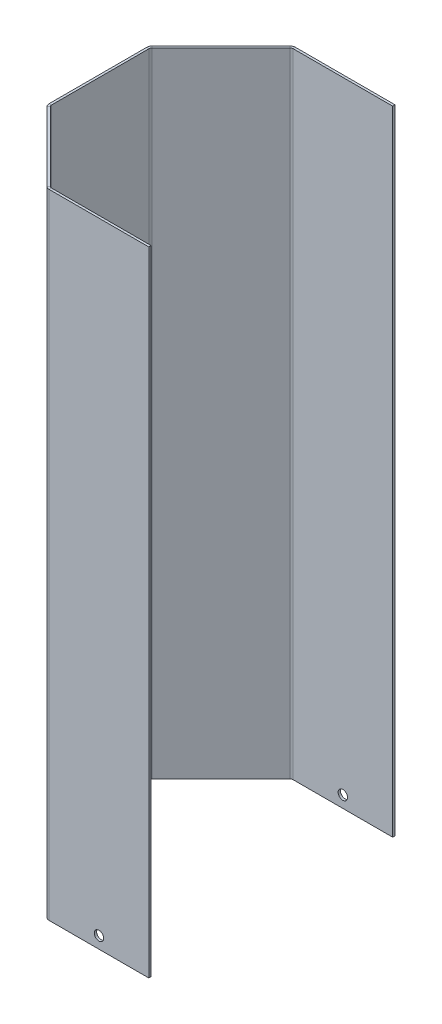
ISO-10303-21;
HEADER;
FILE_DESCRIPTION(('STEP AP214'),'2;1');
FILE_NAME('part.step','',(''),(''),'','','');
FILE_SCHEMA(('AUTOMOTIVE_DESIGN { 1 0 10303 214 1 1 1 1 }'));
ENDSEC;
DATA;
#1=APPLICATION_CONTEXT('core data for automotive mechanical design processes');
#2=APPLICATION_PROTOCOL_DEFINITION('international standard','automotive_design',2000,#1);
#3=PRODUCT_CONTEXT('',#1,'mechanical');
#4=PRODUCT('Part','Part','',(#3));
#5=PRODUCT_RELATED_PRODUCT_CATEGORY('part','',(#4));
#6=PRODUCT_DEFINITION_FORMATION('','',#4);
#7=PRODUCT_DEFINITION_CONTEXT('part definition',#1,'design');
#8=PRODUCT_DEFINITION('design','',#6,#7);
#9=PRODUCT_DEFINITION_SHAPE('','',#8);
#10=(LENGTH_UNIT() NAMED_UNIT(*) SI_UNIT(.MILLI.,.METRE.));
#11=(NAMED_UNIT(*) PLANE_ANGLE_UNIT() SI_UNIT($,.RADIAN.));
#12=(NAMED_UNIT(*) SI_UNIT($,.STERADIAN.) SOLID_ANGLE_UNIT());
#13=UNCERTAINTY_MEASURE_WITH_UNIT(LENGTH_MEASURE(1.E-05),#10,'distance_accuracy_value','');
#14=(GEOMETRIC_REPRESENTATION_CONTEXT(3) GLOBAL_UNCERTAINTY_ASSIGNED_CONTEXT((#13)) GLOBAL_UNIT_ASSIGNED_CONTEXT((#10,
#11,#12)) REPRESENTATION_CONTEXT('',''));
#15=CARTESIAN_POINT('',(0.,0.,0.));
#16=DIRECTION('',(0.,0.,1.));
#17=DIRECTION('',(1.,0.,0.));
#18=AXIS2_PLACEMENT_3D('',#15,#16,#17);
#19=CARTESIAN_POINT('',(-220.704754347643,270.,-51.1485281374239));
#20=DIRECTION('',(0.,1.,0.));
#21=DIRECTION('',(0.,0.,1.));
#22=AXIS2_PLACEMENT_3D('',#19,#20,#21);
#23=PLANE('',#22);
#24=DIRECTION('',(-0.707106781186547,0.,-0.707106781186547));
#25=VECTOR('',#24,1.);
#26=CARTESIAN_POINT('',(-220.704754347643,270.,-51.1485281374239));
#27=LINE('',#26,#25);
#28=CARTESIAN_POINT('',(-220.704754347643,270.,-51.1485281374239));
#29=VERTEX_POINT('',#28);
#30=CARTESIAN_POINT('',(-221.411861128829,270.,-51.8556349186104));
#31=VERTEX_POINT('',#30);
#32=EDGE_CURVE('E11',#29,#31,#27,.T.);
#33=ORIENTED_EDGE('',*,*,#32,.F.);
#34=CARTESIAN_POINT('',(-219.856226210219,270.,-50.3));
#35=DIRECTION('',(0.,-1.,0.));
#36=DIRECTION('',(0.,0.,-1.));
#37=AXIS2_PLACEMENT_3D('',#34,#35,#36);
#38=CIRCLE('',#37,1.2);
#39=CARTESIAN_POINT('',(-219.856226210219,270.,-51.5));
#40=VERTEX_POINT('',#39);
#41=EDGE_CURVE('E366',#40,#29,#38,.F.);
#42=ORIENTED_EDGE('',*,*,#41,.F.);
#43=DIRECTION('',(0.,0.,1.));
#44=VECTOR('',#43,1.);
#45=CARTESIAN_POINT('',(-219.856226210219,270.,-52.5));
#46=LINE('',#45,#44);
#47=CARTESIAN_POINT('',(-219.856226210219,270.,-52.5));
#48=VERTEX_POINT('',#47);
#49=EDGE_CURVE('E43',#48,#40,#46,.T.);
#50=ORIENTED_EDGE('',*,*,#49,.F.);
#51=CARTESIAN_POINT('',(-219.856226210219,270.,-50.3));
#52=DIRECTION('',(0.,1.,0.));
#53=DIRECTION('',(1.,0.,0.));
#54=AXIS2_PLACEMENT_3D('',#51,#52,#53);
#55=CIRCLE('',#54,2.2);
#56=EDGE_CURVE('E379',#48,#31,#55,.T.);
#57=ORIENTED_EDGE('',*,*,#56,.T.);
#58=EDGE_LOOP('',(#33,#42,#50,#57));
#59=FACE_BOUND('',#58,.T.);
#60=ADVANCED_FACE('F34',(#59),#23,.T.);
#61=CARTESIAN_POINT('',(-219.856226210219,270.,-52.5));
#62=DIRECTION('',(0.,1.,0.));
#63=DIRECTION('',(0.,0.,1.));
#64=AXIS2_PLACEMENT_3D('',#61,#62,#63);
#65=PLANE('',#64);
#66=DIRECTION('',(-0.707106781186548,0.,0.707106781186547));
#67=VECTOR('',#66,1.);
#68=CARTESIAN_POINT('',(-220.353282485067,270.,-51.5));
#69=LINE('',#68,#67);
#70=CARTESIAN_POINT('',(-250.169812160276,270.,-21.6834703247905));
#71=VERTEX_POINT('',#70);
#72=EDGE_CURVE('E370',#29,#71,#69,.T.);
#73=ORIENTED_EDGE('',*,*,#72,.F.);
#74=ORIENTED_EDGE('',*,*,#32,.T.);
#75=DIRECTION('',(-0.707106781186548,0.,0.707106781186547));
#76=VECTOR('',#75,1.);
#77=CARTESIAN_POINT('',(-221.060389266253,270.,-52.2071067811866));
#78=LINE('',#77,#76);
#79=CARTESIAN_POINT('',(-250.876918941463,270.,-22.3905771059771));
#80=VERTEX_POINT('',#79);
#81=EDGE_CURVE('E381',#31,#80,#78,.T.);
#82=ORIENTED_EDGE('',*,*,#81,.T.);
#83=DIRECTION('',(0.707106781186523,0.,0.707106781186572));
#84=VECTOR('',#83,1.);
#85=CARTESIAN_POINT('',(-250.876918941463,270.,-22.3905771059771));
#86=LINE('',#85,#84);
#87=EDGE_CURVE('E339',#80,#71,#86,.T.);
#88=ORIENTED_EDGE('',*,*,#87,.T.);
#89=EDGE_LOOP('',(#73,#74,#82,#88));
#90=FACE_BOUND('',#89,.T.);
#91=ADVANCED_FACE('F451',(#90),#65,.T.);
#92=CARTESIAN_POINT('',(-219.856226210219,0.,-51.5));
#93=DIRECTION('',(0.,-1.,0.));
#94=DIRECTION('',(0.,0.,-1.));
#95=AXIS2_PLACEMENT_3D('',#92,#93,#94);
#96=PLANE('',#95);
#97=DIRECTION('',(0.,0.,-1.));
#98=VECTOR('',#97,1.);
#99=CARTESIAN_POINT('',(-219.856226210219,0.,-51.5));
#100=LINE('',#99,#98);
#101=CARTESIAN_POINT('',(-219.856226210219,0.,-51.5));
#102=VERTEX_POINT('',#101);
#103=CARTESIAN_POINT('',(-219.856226210219,0.,-52.5));
#104=VERTEX_POINT('',#103);
#105=EDGE_CURVE('E345',#102,#104,#100,.T.);
#106=ORIENTED_EDGE('',*,*,#105,.F.);
#107=CARTESIAN_POINT('',(-219.856226210219,0.,-50.3));
#108=DIRECTION('',(0.,-1.,0.));
#109=DIRECTION('',(0.,0.,-1.));
#110=AXIS2_PLACEMENT_3D('',#107,#108,#109);
#111=CIRCLE('',#110,1.2);
#112=CARTESIAN_POINT('',(-220.704754347643,0.,-51.1485281374239));
#113=VERTEX_POINT('',#112);
#114=EDGE_CURVE('E249',#102,#113,#111,.F.);
#115=ORIENTED_EDGE('',*,*,#114,.T.);
#116=DIRECTION('',(0.707106781186547,0.,0.707106781186547));
#117=VECTOR('',#116,1.);
#118=CARTESIAN_POINT('',(-221.411861128829,0.,-51.8556349186104));
#119=LINE('',#118,#117);
#120=CARTESIAN_POINT('',(-221.411861128829,0.,-51.8556349186104));
#121=VERTEX_POINT('',#120);
#122=EDGE_CURVE('E343',#121,#113,#119,.T.);
#123=ORIENTED_EDGE('',*,*,#122,.F.);
#124=CARTESIAN_POINT('',(-219.856226210219,0.,-50.3));
#125=DIRECTION('',(0.,1.,0.));
#126=DIRECTION('',(1.,0.,0.));
#127=AXIS2_PLACEMENT_3D('',#124,#125,#126);
#128=CIRCLE('',#127,2.2);
#129=EDGE_CURVE('E261',#104,#121,#128,.T.);
#130=ORIENTED_EDGE('',*,*,#129,.F.);
#131=EDGE_LOOP('',(#106,#115,#123,#130));
#132=FACE_BOUND('',#131,.T.);
#133=ADVANCED_FACE('F493',(#132),#96,.T.);
#134=CARTESIAN_POINT('',(-221.411861128829,0.,-51.8556349186104));
#135=DIRECTION('',(0.,-1.,0.));
#136=DIRECTION('',(0.,0.,-1.));
#137=AXIS2_PLACEMENT_3D('',#134,#135,#136);
#138=PLANE('',#137);
#139=DIRECTION('',(-1.,0.,0.));
#140=VECTOR('',#139,1.);
#141=CARTESIAN_POINT('',(-177.353282485067,0.,-51.5));
#142=LINE('',#141,#140);
#143=CARTESIAN_POINT('',(-177.353282485067,0.,-51.5));
#144=VERTEX_POINT('',#143);
#145=EDGE_CURVE('E252',#144,#102,#142,.T.);
#146=ORIENTED_EDGE('',*,*,#145,.T.);
#147=ORIENTED_EDGE('',*,*,#105,.T.);
#148=DIRECTION('',(-1.,0.,0.));
#149=VECTOR('',#148,1.);
#150=CARTESIAN_POINT('',(-177.353282485067,0.,-52.5));
#151=LINE('',#150,#149);
#152=CARTESIAN_POINT('',(-177.353282485067,0.,-52.5));
#153=VERTEX_POINT('',#152);
#154=EDGE_CURVE('E258',#153,#104,#151,.T.);
#155=ORIENTED_EDGE('',*,*,#154,.F.);
#156=DIRECTION('',(0.,0.,1.));
#157=VECTOR('',#156,1.);
#158=CARTESIAN_POINT('',(-177.353282485067,0.,-52.5));
#159=LINE('',#158,#157);
#160=EDGE_CURVE('E255',#153,#144,#159,.T.);
#161=ORIENTED_EDGE('',*,*,#160,.T.);
#162=EDGE_LOOP('',(#146,#147,#155,#161));
#163=FACE_BOUND('',#162,.T.);
#164=ADVANCED_FACE('F497',(#163),#138,.T.);
#165=CARTESIAN_POINT('',(-250.521284022852,270.,-20.8349421873666));
#166=DIRECTION('',(0.,1.,0.));
#167=DIRECTION('',(0.,0.,1.));
#168=AXIS2_PLACEMENT_3D('',#165,#166,#167);
#169=PLANE('',#168);
#170=DIRECTION('',(-1.,0.,0.));
#171=VECTOR('',#170,1.);
#172=CARTESIAN_POINT('',(-250.521284022852,270.,-20.8349421873666));
#173=LINE('',#172,#171);
#174=CARTESIAN_POINT('',(-250.521284022852,270.,-20.8349421873666));
#175=VERTEX_POINT('',#174);
#176=CARTESIAN_POINT('',(-251.521284022852,270.,-20.8349421873666));
#177=VERTEX_POINT('',#176);
#178=EDGE_CURVE('E341',#175,#177,#173,.T.);
#179=ORIENTED_EDGE('',*,*,#178,.F.);
#180=CARTESIAN_POINT('',(-249.321284022852,270.,-20.8349421873666));
#181=DIRECTION('',(0.,-1.,0.));
#182=DIRECTION('',(0.,0.,-1.));
#183=AXIS2_PLACEMENT_3D('',#180,#181,#182);
#184=CIRCLE('',#183,1.2);
#185=EDGE_CURVE('E441',#71,#175,#184,.F.);
#186=ORIENTED_EDGE('',*,*,#185,.F.);
#187=ORIENTED_EDGE('',*,*,#87,.F.);
#188=CARTESIAN_POINT('',(-249.321284022852,270.,-20.8349421873666));
#189=DIRECTION('',(0.,1.,0.));
#190=DIRECTION('',(1.,0.,0.));
#191=AXIS2_PLACEMENT_3D('',#188,#189,#190);
#192=CIRCLE('',#191,2.2);
#193=EDGE_CURVE('E384',#80,#177,#192,.T.);
#194=ORIENTED_EDGE('',*,*,#193,.T.);
#195=EDGE_LOOP('',(#179,#186,#187,#194));
#196=FACE_BOUND('',#195,.T.);
#197=ADVANCED_FACE('F458',(#196),#169,.T.);
#198=CARTESIAN_POINT('',(-250.876918941463,270.,-22.3905771059771));
#199=DIRECTION('',(0.,1.,0.));
#200=DIRECTION('',(0.,0.,1.));
#201=AXIS2_PLACEMENT_3D('',#198,#199,#200);
#202=PLANE('',#201);
#203=DIRECTION('',(0.,0.,1.));
#204=VECTOR('',#203,1.);
#205=CARTESIAN_POINT('',(-250.521284022852,270.,-21.3319984622143));
#206=LINE('',#205,#204);
#207=CARTESIAN_POINT('',(-250.521284022852,270.,20.8349421873667));
#208=VERTEX_POINT('',#207);
#209=EDGE_CURVE('E438',#175,#208,#206,.T.);
#210=ORIENTED_EDGE('',*,*,#209,.F.);
#211=ORIENTED_EDGE('',*,*,#178,.T.);
#212=DIRECTION('',(0.,0.,-1.));
#213=VECTOR('',#212,1.);
#214=CARTESIAN_POINT('',(-251.521284022852,270.,-21.3319984622143));
#215=LINE('',#214,#213);
#216=CARTESIAN_POINT('',(-251.521284022852,270.,20.8349421873667));
#217=VERTEX_POINT('',#216);
#218=EDGE_CURVE('E202',#177,#217,#215,.F.);
#219=ORIENTED_EDGE('',*,*,#218,.T.);
#220=DIRECTION('',(1.,0.,0.));
#221=VECTOR('',#220,1.);
#222=CARTESIAN_POINT('',(-251.521284022852,270.,20.8349421873667));
#223=LINE('',#222,#221);
#224=EDGE_CURVE('E193',#217,#208,#223,.T.);
#225=ORIENTED_EDGE('',*,*,#224,.T.);
#226=EDGE_LOOP('',(#210,#211,#219,#225));
#227=FACE_BOUND('',#226,.T.);
#228=ADVANCED_FACE('F390',(#227),#202,.T.);
#229=CARTESIAN_POINT('',(-250.169812160276,0.,-21.6834703247905));
#230=DIRECTION('',(0.,-1.,0.));
#231=DIRECTION('',(0.,0.,-1.));
#232=AXIS2_PLACEMENT_3D('',#229,#230,#231);
#233=PLANE('',#232);
#234=DIRECTION('',(-0.707106781186523,0.,-0.707106781186572));
#235=VECTOR('',#234,1.);
#236=CARTESIAN_POINT('',(-250.169812160276,0.,-21.6834703247905));
#237=LINE('',#236,#235);
#238=CARTESIAN_POINT('',(-250.169812160276,0.,-21.6834703247905));
#239=VERTEX_POINT('',#238);
#240=CARTESIAN_POINT('',(-250.876918941463,0.,-22.3905771059771));
#241=VERTEX_POINT('',#240);
#242=EDGE_CURVE('E337',#239,#241,#237,.T.);
#243=ORIENTED_EDGE('',*,*,#242,.F.);
#244=CARTESIAN_POINT('',(-249.321284022852,0.,-20.8349421873666));
#245=DIRECTION('',(0.,-1.,0.));
#246=DIRECTION('',(0.,0.,-1.));
#247=AXIS2_PLACEMENT_3D('',#244,#245,#246);
#248=CIRCLE('',#247,1.2);
#249=CARTESIAN_POINT('',(-250.521284022852,0.,-20.8349421873666));
#250=VERTEX_POINT('',#249);
#251=EDGE_CURVE('E243',#239,#250,#248,.F.);
#252=ORIENTED_EDGE('',*,*,#251,.T.);
#253=DIRECTION('',(1.,0.,0.));
#254=VECTOR('',#253,1.);
#255=CARTESIAN_POINT('',(-251.521284022852,0.,-20.8349421873666));
#256=LINE('',#255,#254);
#257=CARTESIAN_POINT('',(-251.521284022852,0.,-20.8349421873666));
#258=VERTEX_POINT('',#257);
#259=EDGE_CURVE('E192',#258,#250,#256,.T.);
#260=ORIENTED_EDGE('',*,*,#259,.F.);
#261=CARTESIAN_POINT('',(-249.321284022852,0.,-20.8349421873666));
#262=DIRECTION('',(0.,1.,0.));
#263=DIRECTION('',(1.,0.,0.));
#264=AXIS2_PLACEMENT_3D('',#261,#262,#263);
#265=CIRCLE('',#264,2.2);
#266=EDGE_CURVE('E267',#241,#258,#265,.T.);
#267=ORIENTED_EDGE('',*,*,#266,.F.);
#268=EDGE_LOOP('',(#243,#252,#260,#267));
#269=FACE_BOUND('',#268,.T.);
#270=ADVANCED_FACE('F467',(#269),#233,.T.);
#271=CARTESIAN_POINT('',(-251.521284022852,0.,-20.8349421873666));
#272=DIRECTION('',(0.,-1.,0.));
#273=DIRECTION('',(0.,0.,-1.));
#274=AXIS2_PLACEMENT_3D('',#271,#272,#273);
#275=PLANE('',#274);
#276=DIRECTION('',(-0.707106781186548,0.,0.707106781186547));
#277=VECTOR('',#276,1.);
#278=CARTESIAN_POINT('',(-220.353282485067,0.,-51.5));
#279=LINE('',#278,#277);
#280=EDGE_CURVE('E246',#113,#239,#279,.T.);
#281=ORIENTED_EDGE('',*,*,#280,.T.);
#282=ORIENTED_EDGE('',*,*,#242,.T.);
#283=DIRECTION('',(-0.707106781186548,0.,0.707106781186547));
#284=VECTOR('',#283,1.);
#285=CARTESIAN_POINT('',(-221.060389266253,0.,-52.2071067811866));
#286=LINE('',#285,#284);
#287=EDGE_CURVE('E264',#121,#241,#286,.T.);
#288=ORIENTED_EDGE('',*,*,#287,.F.);
#289=ORIENTED_EDGE('',*,*,#122,.T.);
#290=EDGE_LOOP('',(#281,#282,#288,#289));
#291=FACE_BOUND('',#290,.T.);
#292=ADVANCED_FACE('F471',(#291),#275,.T.);
#293=CARTESIAN_POINT('',(-250.169812160276,270.,21.6834703247906));
#294=DIRECTION('',(0.,1.,0.));
#295=DIRECTION('',(0.,0.,1.));
#296=AXIS2_PLACEMENT_3D('',#293,#294,#295);
#297=PLANE('',#296);
#298=DIRECTION('',(-0.707106781186556,0.,0.707106781186539));
#299=VECTOR('',#298,1.);
#300=CARTESIAN_POINT('',(-250.169812160276,270.,21.6834703247906));
#301=LINE('',#300,#299);
#302=CARTESIAN_POINT('',(-250.169812160276,270.,21.6834703247906));
#303=VERTEX_POINT('',#302);
#304=CARTESIAN_POINT('',(-250.876918941463,270.,22.3905771059772));
#305=VERTEX_POINT('',#304);
#306=EDGE_CURVE('E180',#303,#305,#301,.T.);
#307=ORIENTED_EDGE('',*,*,#306,.F.);
#308=CARTESIAN_POINT('',(-249.321284022852,270.,20.8349421873667));
#309=DIRECTION('',(0.,-1.,0.));
#310=DIRECTION('',(0.,0.,-1.));
#311=AXIS2_PLACEMENT_3D('',#308,#309,#310);
#312=CIRCLE('',#311,1.2);
#313=EDGE_CURVE('E402',#208,#303,#312,.F.);
#314=ORIENTED_EDGE('',*,*,#313,.F.);
#315=ORIENTED_EDGE('',*,*,#224,.F.);
#316=CARTESIAN_POINT('',(-249.321284022852,270.,20.8349421873667));
#317=DIRECTION('',(0.,1.,0.));
#318=DIRECTION('',(1.,0.,0.));
#319=AXIS2_PLACEMENT_3D('',#316,#317,#318);
#320=CIRCLE('',#319,2.2);
#321=EDGE_CURVE('E196',#217,#305,#320,.T.);
#322=ORIENTED_EDGE('',*,*,#321,.T.);
#323=EDGE_LOOP('',(#307,#314,#315,#322));
#324=FACE_BOUND('',#323,.T.);
#325=ADVANCED_FACE('F198',(#324),#297,.T.);
#326=CARTESIAN_POINT('',(-251.521284022852,270.,20.8349421873667));
#327=DIRECTION('',(0.,1.,0.));
#328=DIRECTION('',(0.,0.,1.));
#329=AXIS2_PLACEMENT_3D('',#326,#327,#328);
#330=PLANE('',#329);
#331=DIRECTION('',(0.707106781186548,0.,0.707106781186547));
#332=VECTOR('',#331,1.);
#333=CARTESIAN_POINT('',(-250.521284022852,270.,21.3319984622144));
#334=LINE('',#333,#332);
#335=CARTESIAN_POINT('',(-220.704754347643,270.,51.1485281374239));
#336=VERTEX_POINT('',#335);
#337=EDGE_CURVE('E187',#303,#336,#334,.T.);
#338=ORIENTED_EDGE('',*,*,#337,.F.);
#339=ORIENTED_EDGE('',*,*,#306,.T.);
#340=DIRECTION('',(0.707106781186548,0.,0.707106781186547));
#341=VECTOR('',#340,1.);
#342=CARTESIAN_POINT('',(-251.228390804039,270.,22.039105243401));
#343=LINE('',#342,#341);
#344=CARTESIAN_POINT('',(-221.411861128829,270.,51.8556349186104));
#345=VERTEX_POINT('',#344);
#346=EDGE_CURVE('E184',#305,#345,#343,.T.);
#347=ORIENTED_EDGE('',*,*,#346,.T.);
#348=DIRECTION('',(0.707106781186537,0.,-0.707106781186558));
#349=VECTOR('',#348,1.);
#350=CARTESIAN_POINT('',(-221.411861128829,270.,51.8556349186104));
#351=LINE('',#350,#349);
#352=EDGE_CURVE('E328',#345,#336,#351,.T.);
#353=ORIENTED_EDGE('',*,*,#352,.T.);
#354=EDGE_LOOP('',(#338,#339,#347,#353));
#355=FACE_BOUND('',#354,.T.);
#356=ADVANCED_FACE('F182',(#355),#330,.T.);
#357=CARTESIAN_POINT('',(-250.521284022852,0.,20.8349421873667));
#358=DIRECTION('',(0.,-1.,0.));
#359=DIRECTION('',(0.,0.,-1.));
#360=AXIS2_PLACEMENT_3D('',#357,#358,#359);
#361=PLANE('',#360);
#362=DIRECTION('',(-1.,0.,0.));
#363=VECTOR('',#362,1.);
#364=CARTESIAN_POINT('',(-250.521284022852,0.,20.8349421873667));
#365=LINE('',#364,#363);
#366=CARTESIAN_POINT('',(-250.521284022852,0.,20.8349421873667));
#367=VERTEX_POINT('',#366);
#368=CARTESIAN_POINT('',(-251.521284022852,0.,20.8349421873667));
#369=VERTEX_POINT('',#368);
#370=EDGE_CURVE('E333',#367,#369,#365,.T.);
#371=ORIENTED_EDGE('',*,*,#370,.F.);
#372=CARTESIAN_POINT('',(-249.321284022852,0.,20.8349421873667));
#373=DIRECTION('',(0.,-1.,0.));
#374=DIRECTION('',(0.,0.,-1.));
#375=AXIS2_PLACEMENT_3D('',#372,#373,#374);
#376=CIRCLE('',#375,1.2);
#377=CARTESIAN_POINT('',(-250.169812160276,0.,21.6834703247906));
#378=VERTEX_POINT('',#377);
#379=EDGE_CURVE('E237',#367,#378,#376,.F.);
#380=ORIENTED_EDGE('',*,*,#379,.T.);
#381=DIRECTION('',(0.707106781186556,0.,-0.707106781186539));
#382=VECTOR('',#381,1.);
#383=CARTESIAN_POINT('',(-250.876918941463,0.,22.3905771059772));
#384=LINE('',#383,#382);
#385=CARTESIAN_POINT('',(-250.876918941463,0.,22.3905771059772));
#386=VERTEX_POINT('',#385);
#387=EDGE_CURVE('E331',#386,#378,#384,.T.);
#388=ORIENTED_EDGE('',*,*,#387,.F.);
#389=CARTESIAN_POINT('',(-249.321284022852,0.,20.8349421873667));
#390=DIRECTION('',(0.,1.,0.));
#391=DIRECTION('',(1.,0.,0.));
#392=AXIS2_PLACEMENT_3D('',#389,#390,#391);
#393=CIRCLE('',#392,2.2);
#394=EDGE_CURVE('E209',#369,#386,#393,.T.);
#395=ORIENTED_EDGE('',*,*,#394,.F.);
#396=EDGE_LOOP('',(#371,#380,#388,#395));
#397=FACE_BOUND('',#396,.T.);
#398=ADVANCED_FACE('F396',(#397),#361,.T.);
#399=CARTESIAN_POINT('',(-250.876918941463,0.,22.3905771059772));
#400=DIRECTION('',(0.,-1.,0.));
#401=DIRECTION('',(0.,0.,-1.));
#402=AXIS2_PLACEMENT_3D('',#399,#400,#401);
#403=PLANE('',#402);
#404=DIRECTION('',(0.,0.,1.));
#405=VECTOR('',#404,1.);
#406=CARTESIAN_POINT('',(-250.521284022852,0.,-21.3319984622143));
#407=LINE('',#406,#405);
#408=EDGE_CURVE('E240',#250,#367,#407,.T.);
#409=ORIENTED_EDGE('',*,*,#408,.T.);
#410=ORIENTED_EDGE('',*,*,#370,.T.);
#411=DIRECTION('',(0.,0.,-1.));
#412=VECTOR('',#411,1.);
#413=CARTESIAN_POINT('',(-251.521284022852,0.,-21.3319984622143));
#414=LINE('',#413,#412);
#415=EDGE_CURVE('E270',#258,#369,#414,.F.);
#416=ORIENTED_EDGE('',*,*,#415,.F.);
#417=ORIENTED_EDGE('',*,*,#259,.T.);
#418=EDGE_LOOP('',(#409,#410,#416,#417));
#419=FACE_BOUND('',#418,.T.);
#420=ADVANCED_FACE('F477',(#419),#403,.T.);
#421=CARTESIAN_POINT('',(-219.856226210219,270.,51.5));
#422=DIRECTION('',(0.,1.,0.));
#423=DIRECTION('',(0.,0.,1.));
#424=AXIS2_PLACEMENT_3D('',#421,#422,#423);
#425=PLANE('',#424);
#426=DIRECTION('',(0.,0.,1.));
#427=VECTOR('',#426,1.);
#428=CARTESIAN_POINT('',(-219.856226210219,270.,51.5));
#429=LINE('',#428,#427);
#430=CARTESIAN_POINT('',(-219.856226210219,270.,51.5));
#431=VERTEX_POINT('',#430);
#432=CARTESIAN_POINT('',(-219.856226210219,270.,52.5));
#433=VERTEX_POINT('',#432);
#434=EDGE_CURVE('E51',#431,#433,#429,.T.);
#435=ORIENTED_EDGE('',*,*,#434,.F.);
#436=CARTESIAN_POINT('',(-219.856226210219,270.,50.3));
#437=DIRECTION('',(0.,-1.,0.));
#438=DIRECTION('',(0.,0.,-1.));
#439=AXIS2_PLACEMENT_3D('',#436,#437,#438);
#440=CIRCLE('',#439,1.2);
#441=EDGE_CURVE('E430',#336,#431,#440,.F.);
#442=ORIENTED_EDGE('',*,*,#441,.F.);
#443=ORIENTED_EDGE('',*,*,#352,.F.);
#444=CARTESIAN_POINT('',(-219.856226210219,270.,50.3));
#445=DIRECTION('',(0.,1.,0.));
#446=DIRECTION('',(1.,0.,0.));
#447=AXIS2_PLACEMENT_3D('',#444,#445,#446);
#448=CIRCLE('',#447,2.2);
#449=EDGE_CURVE('E217',#345,#433,#448,.T.);
#450=ORIENTED_EDGE('',*,*,#449,.T.);
#451=EDGE_LOOP('',(#435,#442,#443,#450));
#452=FACE_BOUND('',#451,.T.);
#453=ADVANCED_FACE('F479',(#452),#425,.T.);
#454=CARTESIAN_POINT('',(-221.411861128829,270.,51.8556349186104));
#455=DIRECTION('',(0.,1.,0.));
#456=DIRECTION('',(0.,0.,1.));
#457=AXIS2_PLACEMENT_3D('',#454,#455,#456);
#458=PLANE('',#457);
#459=DIRECTION('',(1.,0.,0.));
#460=VECTOR('',#459,1.);
#461=CARTESIAN_POINT('',(-220.353282485067,270.,51.5));
#462=LINE('',#461,#460);
#463=CARTESIAN_POINT('',(-177.353282485067,270.,51.5));
#464=VERTEX_POINT('',#463);
#465=EDGE_CURVE('E428',#431,#464,#462,.T.);
#466=ORIENTED_EDGE('',*,*,#465,.F.);
#467=ORIENTED_EDGE('',*,*,#434,.T.);
#468=DIRECTION('',(1.,0.,0.));
#469=VECTOR('',#468,1.);
#470=CARTESIAN_POINT('',(-220.353282485067,270.,52.5));
#471=LINE('',#470,#469);
#472=CARTESIAN_POINT('',(-177.353282485067,270.,52.5));
#473=VERTEX_POINT('',#472);
#474=EDGE_CURVE('E129',#433,#473,#471,.T.);
#475=ORIENTED_EDGE('',*,*,#474,.T.);
#476=DIRECTION('',(0.,0.,1.));
#477=VECTOR('',#476,1.);
#478=CARTESIAN_POINT('',(-177.353282485067,270.,51.5));
#479=LINE('',#478,#477);
#480=EDGE_CURVE('E426',#464,#473,#479,.T.);
#481=ORIENTED_EDGE('',*,*,#480,.F.);
#482=EDGE_LOOP('',(#466,#467,#475,#481));
#483=FACE_BOUND('',#482,.T.);
#484=ADVANCED_FACE('F485',(#483),#458,.T.);
#485=CARTESIAN_POINT('',(-220.704754347643,0.,51.1485281374239));
#486=DIRECTION('',(0.,-1.,0.));
#487=DIRECTION('',(0.,0.,-1.));
#488=AXIS2_PLACEMENT_3D('',#485,#486,#487);
#489=PLANE('',#488);
#490=DIRECTION('',(-0.707106781186537,0.,0.707106781186558));
#491=VECTOR('',#490,1.);
#492=CARTESIAN_POINT('',(-220.704754347643,0.,51.1485281374239));
#493=LINE('',#492,#491);
#494=CARTESIAN_POINT('',(-220.704754347643,0.,51.1485281374239));
#495=VERTEX_POINT('',#494);
#496=CARTESIAN_POINT('',(-221.411861128829,0.,51.8556349186104));
#497=VERTEX_POINT('',#496);
#498=EDGE_CURVE('E116',#495,#497,#493,.T.);
#499=ORIENTED_EDGE('',*,*,#498,.F.);
#500=CARTESIAN_POINT('',(-219.856226210219,0.,50.3));
#501=DIRECTION('',(0.,-1.,0.));
#502=DIRECTION('',(0.,0.,-1.));
#503=AXIS2_PLACEMENT_3D('',#500,#501,#502);
#504=CIRCLE('',#503,1.2);
#505=CARTESIAN_POINT('',(-219.856226210219,0.,51.5));
#506=VERTEX_POINT('',#505);
#507=EDGE_CURVE('E233',#495,#506,#504,.F.);
#508=ORIENTED_EDGE('',*,*,#507,.T.);
#509=DIRECTION('',(0.,0.,-1.));
#510=VECTOR('',#509,1.);
#511=CARTESIAN_POINT('',(-219.856226210219,0.,52.5));
#512=LINE('',#511,#510);
#513=CARTESIAN_POINT('',(-219.856226210219,0.,52.5));
#514=VERTEX_POINT('',#513);
#515=EDGE_CURVE('E123',#514,#506,#512,.T.);
#516=ORIENTED_EDGE('',*,*,#515,.F.);
#517=CARTESIAN_POINT('',(-219.856226210219,0.,50.3));
#518=DIRECTION('',(0.,1.,0.));
#519=DIRECTION('',(1.,0.,0.));
#520=AXIS2_PLACEMENT_3D('',#517,#518,#519);
#521=CIRCLE('',#520,2.2);
#522=EDGE_CURVE('E276',#497,#514,#521,.T.);
#523=ORIENTED_EDGE('',*,*,#522,.F.);
#524=EDGE_LOOP('',(#499,#508,#516,#523));
#525=FACE_BOUND('',#524,.T.);
#526=ADVANCED_FACE('F413',(#525),#489,.T.);
#527=CARTESIAN_POINT('',(-219.856226210219,0.,52.5));
#528=DIRECTION('',(0.,-1.,0.));
#529=DIRECTION('',(0.,0.,-1.));
#530=AXIS2_PLACEMENT_3D('',#527,#528,#529);
#531=PLANE('',#530);
#532=DIRECTION('',(0.707106781186548,0.,0.707106781186547));
#533=VECTOR('',#532,1.);
#534=CARTESIAN_POINT('',(-250.521284022852,0.,21.3319984622144));
#535=LINE('',#534,#533);
#536=EDGE_CURVE('E235',#378,#495,#535,.T.);
#537=ORIENTED_EDGE('',*,*,#536,.T.);
#538=ORIENTED_EDGE('',*,*,#498,.T.);
#539=DIRECTION('',(0.707106781186548,0.,0.707106781186547));
#540=VECTOR('',#539,1.);
#541=CARTESIAN_POINT('',(-251.228390804039,0.,22.039105243401));
#542=LINE('',#541,#540);
#543=EDGE_CURVE('E274',#386,#497,#542,.T.);
#544=ORIENTED_EDGE('',*,*,#543,.F.);
#545=ORIENTED_EDGE('',*,*,#387,.T.);
#546=EDGE_LOOP('',(#537,#538,#544,#545));
#547=FACE_BOUND('',#546,.T.);
#548=ADVANCED_FACE('F398',(#547),#531,.T.);
#549=CARTESIAN_POINT('',(-220.353282485067,270.,52.5));
#550=DIRECTION('',(0.,0.,-1.));
#551=DIRECTION('',(-1.,0.,0.));
#552=AXIS2_PLACEMENT_3D('',#549,#550,#551);
#553=PLANE('',#552);
#554=CARTESIAN_POINT('',(-198.604754347643,5.,52.5));
#555=DIRECTION('',(0.,0.,1.));
#556=DIRECTION('',(1.,0.,0.));
#557=AXIS2_PLACEMENT_3D('',#554,#555,#556);
#558=CIRCLE('',#557,2.);
#559=CARTESIAN_POINT('',(-196.604754347643,5.,52.5));
#560=VERTEX_POINT('',#559);
#561=EDGE_CURVE('E814',#560,#560,#558,.T.);
#562=ORIENTED_EDGE('',*,*,#561,.F.);
#563=EDGE_LOOP('',(#562));
#564=FACE_BOUND('',#563,.T.);
#565=DIRECTION('',(1.,0.,0.));
#566=VECTOR('',#565,1.);
#567=CARTESIAN_POINT('',(-220.353282485067,0.,52.5));
#568=LINE('',#567,#566);
#569=CARTESIAN_POINT('',(-177.353282485067,0.,52.5));
#570=VERTEX_POINT('',#569);
#571=EDGE_CURVE('E223',#514,#570,#568,.T.);
#572=ORIENTED_EDGE('',*,*,#571,.T.);
#573=DIRECTION('',(0.,-1.,0.));
#574=VECTOR('',#573,1.);
#575=CARTESIAN_POINT('',(-177.353282485067,270.,52.5));
#576=LINE('',#575,#574);
#577=EDGE_CURVE('E324',#473,#570,#576,.T.);
#578=ORIENTED_EDGE('',*,*,#577,.F.);
#579=ORIENTED_EDGE('',*,*,#474,.F.);
#580=DIRECTION('',(0.,-1.,0.));
#581=VECTOR('',#580,1.);
#582=CARTESIAN_POINT('',(-219.856226210219,270.,52.5));
#583=LINE('',#582,#581);
#584=EDGE_CURVE('E219',#433,#514,#583,.T.);
#585=ORIENTED_EDGE('',*,*,#584,.T.);
#586=EDGE_LOOP('',(#572,#578,#579,#585));
#587=FACE_BOUND('',#586,.T.);
#588=ADVANCED_FACE('F419',(#564,#587),#553,.F.);
#589=CARTESIAN_POINT('',(-177.353282485067,270.,51.5));
#590=DIRECTION('',(1.,0.,0.));
#591=DIRECTION('',(0.,0.,-1.));
#592=AXIS2_PLACEMENT_3D('',#589,#590,#591);
#593=PLANE('',#592);
#594=DIRECTION('',(0.,0.,1.));
#595=VECTOR('',#594,1.);
#596=CARTESIAN_POINT('',(-177.353282485067,0.,51.5));
#597=LINE('',#596,#595);
#598=CARTESIAN_POINT('',(-177.353282485067,0.,51.5));
#599=VERTEX_POINT('',#598);
#600=EDGE_CURVE('E226',#599,#570,#597,.T.);
#601=ORIENTED_EDGE('',*,*,#600,.F.);
#602=DIRECTION('',(0.,-1.,0.));
#603=VECTOR('',#602,1.);
#604=CARTESIAN_POINT('',(-177.353282485067,270.,51.5));
#605=LINE('',#604,#603);
#606=EDGE_CURVE('E322',#464,#599,#605,.T.);
#607=ORIENTED_EDGE('',*,*,#606,.F.);
#608=ORIENTED_EDGE('',*,*,#480,.T.);
#609=ORIENTED_EDGE('',*,*,#577,.T.);
#610=EDGE_LOOP('',(#601,#607,#608,#609));
#611=FACE_BOUND('',#610,.T.);
#612=ADVANCED_FACE('F424',(#611),#593,.T.);
#613=CARTESIAN_POINT('',(-220.353282485067,270.,51.5));
#614=DIRECTION('',(0.,0.,-1.));
#615=DIRECTION('',(-1.,0.,0.));
#616=AXIS2_PLACEMENT_3D('',#613,#614,#615);
#617=PLANE('',#616);
#618=CARTESIAN_POINT('',(-198.604754347643,5.,51.5));
#619=DIRECTION('',(0.,0.,-1.));
#620=DIRECTION('',(-1.,0.,0.));
#621=AXIS2_PLACEMENT_3D('',#618,#619,#620);
#622=CIRCLE('',#621,2.);
#623=CARTESIAN_POINT('',(-200.604754347643,5.,51.5));
#624=VERTEX_POINT('',#623);
#625=EDGE_CURVE('E227',#624,#624,#622,.T.);
#626=ORIENTED_EDGE('',*,*,#625,.F.);
#627=EDGE_LOOP('',(#626));
#628=FACE_BOUND('',#627,.T.);
#629=DIRECTION('',(1.,0.,0.));
#630=VECTOR('',#629,1.);
#631=CARTESIAN_POINT('',(-220.353282485067,0.,51.5));
#632=LINE('',#631,#630);
#633=EDGE_CURVE('E230',#506,#599,#632,.T.);
#634=ORIENTED_EDGE('',*,*,#633,.F.);
#635=DIRECTION('',(0.,-1.,0.));
#636=VECTOR('',#635,1.);
#637=CARTESIAN_POINT('',(-219.856226210219,270.,51.5));
#638=LINE('',#637,#636);
#639=EDGE_CURVE('E319',#431,#506,#638,.T.);
#640=ORIENTED_EDGE('',*,*,#639,.F.);
#641=ORIENTED_EDGE('',*,*,#465,.T.);
#642=ORIENTED_EDGE('',*,*,#606,.T.);
#643=EDGE_LOOP('',(#634,#640,#641,#642));
#644=FACE_BOUND('',#643,.T.);
#645=ADVANCED_FACE('F574',(#628,#644),#617,.T.);
#646=CARTESIAN_POINT('',(-219.856226210219,270.,50.3));
#647=DIRECTION('',(0.,-1.,0.));
#648=DIRECTION('',(0.,0.,-1.));
#649=AXIS2_PLACEMENT_3D('',#646,#647,#648);
#650=CYLINDRICAL_SURFACE('',#649,1.2);
#651=ORIENTED_EDGE('',*,*,#507,.F.);
#652=DIRECTION('',(0.,-1.,0.));
#653=VECTOR('',#652,1.);
#654=CARTESIAN_POINT('',(-220.704754347643,270.,51.1485281374239));
#655=LINE('',#654,#653);
#656=EDGE_CURVE('E316',#336,#495,#655,.T.);
#657=ORIENTED_EDGE('',*,*,#656,.F.);
#658=ORIENTED_EDGE('',*,*,#441,.T.);
#659=ORIENTED_EDGE('',*,*,#639,.T.);
#660=EDGE_LOOP('',(#651,#657,#658,#659));
#661=FACE_BOUND('',#660,.T.);
#662=ADVANCED_FACE('F410',(#661),#650,.F.);
#663=CARTESIAN_POINT('',(-250.521284022852,270.,21.3319984622144));
#664=DIRECTION('',(0.707106781186547,0.,-0.707106781186548));
#665=DIRECTION('',(-0.707106781186548,0.,-0.707106781186547));
#666=AXIS2_PLACEMENT_3D('',#663,#664,#665);
#667=PLANE('',#666);
#668=ORIENTED_EDGE('',*,*,#536,.F.);
#669=DIRECTION('',(0.,-1.,0.));
#670=VECTOR('',#669,1.);
#671=CARTESIAN_POINT('',(-250.169812160276,270.,21.6834703247906));
#672=LINE('',#671,#670);
#673=EDGE_CURVE('E313',#303,#378,#672,.T.);
#674=ORIENTED_EDGE('',*,*,#673,.F.);
#675=ORIENTED_EDGE('',*,*,#337,.T.);
#676=ORIENTED_EDGE('',*,*,#656,.T.);
#677=EDGE_LOOP('',(#668,#674,#675,#676));
#678=FACE_BOUND('',#677,.T.);
#679=ADVANCED_FACE('F404',(#678),#667,.T.);
#680=CARTESIAN_POINT('',(-249.321284022852,270.,20.8349421873667));
#681=DIRECTION('',(0.,-1.,0.));
#682=DIRECTION('',(0.,0.,-1.));
#683=AXIS2_PLACEMENT_3D('',#680,#681,#682);
#684=CYLINDRICAL_SURFACE('',#683,1.2);
#685=ORIENTED_EDGE('',*,*,#379,.F.);
#686=DIRECTION('',(0.,-1.,0.));
#687=VECTOR('',#686,1.);
#688=CARTESIAN_POINT('',(-250.521284022852,270.,20.8349421873667));
#689=LINE('',#688,#687);
#690=EDGE_CURVE('E310',#208,#367,#689,.T.);
#691=ORIENTED_EDGE('',*,*,#690,.F.);
#692=ORIENTED_EDGE('',*,*,#313,.T.);
#693=ORIENTED_EDGE('',*,*,#673,.T.);
#694=EDGE_LOOP('',(#685,#691,#692,#693));
#695=FACE_BOUND('',#694,.T.);
#696=ADVANCED_FACE('F401',(#695),#684,.F.);
#697=CARTESIAN_POINT('',(-250.521284022852,270.,-21.3319984622143));
#698=DIRECTION('',(1.,0.,0.));
#699=DIRECTION('',(0.,0.,-1.));
#700=AXIS2_PLACEMENT_3D('',#697,#698,#699);
#701=PLANE('',#700);
#702=CARTESIAN_POINT('',(-250.521284022852,5.,0.));
#703=DIRECTION('',(1.,0.,0.));
#704=DIRECTION('',(0.,0.,-1.));
#705=AXIS2_PLACEMENT_3D('',#702,#703,#704);
#706=CIRCLE('',#705,2.);
#707=CARTESIAN_POINT('',(-250.521284022852,5.,-2.));
#708=VERTEX_POINT('',#707);
#709=EDGE_CURVE('E809',#708,#708,#706,.T.);
#710=ORIENTED_EDGE('',*,*,#709,.F.);
#711=EDGE_LOOP('',(#710));
#712=FACE_BOUND('',#711,.T.);
#713=ORIENTED_EDGE('',*,*,#408,.F.);
#714=DIRECTION('',(0.,-1.,0.));
#715=VECTOR('',#714,1.);
#716=CARTESIAN_POINT('',(-250.521284022852,270.,-20.8349421873666));
#717=LINE('',#716,#715);
#718=EDGE_CURVE('E307',#175,#250,#717,.T.);
#719=ORIENTED_EDGE('',*,*,#718,.F.);
#720=ORIENTED_EDGE('',*,*,#209,.T.);
#721=ORIENTED_EDGE('',*,*,#690,.T.);
#722=EDGE_LOOP('',(#713,#719,#720,#721));
#723=FACE_BOUND('',#722,.T.);
#724=ADVANCED_FACE('F464',(#712,#723),#701,.T.);
#725=CARTESIAN_POINT('',(-249.321284022852,270.,-20.8349421873666));
#726=DIRECTION('',(0.,-1.,0.));
#727=DIRECTION('',(0.,0.,-1.));
#728=AXIS2_PLACEMENT_3D('',#725,#726,#727);
#729=CYLINDRICAL_SURFACE('',#728,1.2);
#730=ORIENTED_EDGE('',*,*,#251,.F.);
#731=DIRECTION('',(0.,-1.,0.));
#732=VECTOR('',#731,1.);
#733=CARTESIAN_POINT('',(-250.169812160276,270.,-21.6834703247905));
#734=LINE('',#733,#732);
#735=EDGE_CURVE('E304',#71,#239,#734,.T.);
#736=ORIENTED_EDGE('',*,*,#735,.F.);
#737=ORIENTED_EDGE('',*,*,#185,.T.);
#738=ORIENTED_EDGE('',*,*,#718,.T.);
#739=EDGE_LOOP('',(#730,#736,#737,#738));
#740=FACE_BOUND('',#739,.T.);
#741=ADVANCED_FACE('F457',(#740),#729,.F.);
#742=CARTESIAN_POINT('',(-220.353282485067,270.,-51.5));
#743=DIRECTION('',(0.707106781186547,0.,0.707106781186548));
#744=DIRECTION('',(0.707106781186548,0.,-0.707106781186547));
#745=AXIS2_PLACEMENT_3D('',#742,#743,#744);
#746=PLANE('',#745);
#747=ORIENTED_EDGE('',*,*,#280,.F.);
#748=DIRECTION('',(0.,-1.,0.));
#749=VECTOR('',#748,1.);
#750=CARTESIAN_POINT('',(-220.704754347643,270.,-51.1485281374239));
#751=LINE('',#750,#749);
#752=EDGE_CURVE('E301',#29,#113,#751,.T.);
#753=ORIENTED_EDGE('',*,*,#752,.F.);
#754=ORIENTED_EDGE('',*,*,#72,.T.);
#755=ORIENTED_EDGE('',*,*,#735,.T.);
#756=EDGE_LOOP('',(#747,#753,#754,#755));
#757=FACE_BOUND('',#756,.T.);
#758=ADVANCED_FACE('F447',(#757),#746,.T.);
#759=CARTESIAN_POINT('',(-219.856226210219,270.,-50.3));
#760=DIRECTION('',(0.,-1.,0.));
#761=DIRECTION('',(0.,0.,-1.));
#762=AXIS2_PLACEMENT_3D('',#759,#760,#761);
#763=CYLINDRICAL_SURFACE('',#762,1.2);
#764=ORIENTED_EDGE('',*,*,#114,.F.);
#765=DIRECTION('',(0.,-1.,0.));
#766=VECTOR('',#765,1.);
#767=CARTESIAN_POINT('',(-219.856226210219,270.,-51.5));
#768=LINE('',#767,#766);
#769=EDGE_CURVE('E298',#40,#102,#768,.T.);
#770=ORIENTED_EDGE('',*,*,#769,.F.);
#771=ORIENTED_EDGE('',*,*,#41,.T.);
#772=ORIENTED_EDGE('',*,*,#752,.T.);
#773=EDGE_LOOP('',(#764,#770,#771,#772));
#774=FACE_BOUND('',#773,.T.);
#775=ADVANCED_FACE('F365',(#774),#763,.F.);
#776=CARTESIAN_POINT('',(-177.353282485067,270.,-51.5));
#777=DIRECTION('',(0.,0.,1.));
#778=DIRECTION('',(1.,0.,0.));
#779=AXIS2_PLACEMENT_3D('',#776,#777,#778);
#780=PLANE('',#779);
#781=CARTESIAN_POINT('',(-198.604754347643,5.,-51.5));
#782=DIRECTION('',(0.,0.,1.));
#783=DIRECTION('',(1.,0.,0.));
#784=AXIS2_PLACEMENT_3D('',#781,#782,#783);
#785=CIRCLE('',#784,2.);
#786=CARTESIAN_POINT('',(-196.604754347643,5.,-51.5));
#787=VERTEX_POINT('',#786);
#788=EDGE_CURVE('E819',#787,#787,#785,.T.);
#789=ORIENTED_EDGE('',*,*,#788,.F.);
#790=EDGE_LOOP('',(#789));
#791=FACE_BOUND('',#790,.T.);
#792=ORIENTED_EDGE('',*,*,#145,.F.);
#793=DIRECTION('',(0.,-1.,0.));
#794=VECTOR('',#793,1.);
#795=CARTESIAN_POINT('',(-177.353282485067,270.,-51.5));
#796=LINE('',#795,#794);
#797=CARTESIAN_POINT('',(-177.353282485067,270.,-51.5));
#798=VERTEX_POINT('',#797);
#799=EDGE_CURVE('E296',#798,#144,#796,.T.);
#800=ORIENTED_EDGE('',*,*,#799,.F.);
#801=DIRECTION('',(-1.,0.,0.));
#802=VECTOR('',#801,1.);
#803=CARTESIAN_POINT('',(-177.353282485067,270.,-51.5));
#804=LINE('',#803,#802);
#805=EDGE_CURVE('E354',#798,#40,#804,.T.);
#806=ORIENTED_EDGE('',*,*,#805,.T.);
#807=ORIENTED_EDGE('',*,*,#769,.T.);
#808=EDGE_LOOP('',(#792,#800,#806,#807));
#809=FACE_BOUND('',#808,.T.);
#810=ADVANCED_FACE('F372',(#791,#809),#780,.T.);
#811=CARTESIAN_POINT('',(-177.353282485067,270.,-52.5));
#812=DIRECTION('',(1.,0.,0.));
#813=DIRECTION('',(0.,0.,-1.));
#814=AXIS2_PLACEMENT_3D('',#811,#812,#813);
#815=PLANE('',#814);
#816=ORIENTED_EDGE('',*,*,#160,.F.);
#817=DIRECTION('',(0.,-1.,0.));
#818=VECTOR('',#817,1.);
#819=CARTESIAN_POINT('',(-177.353282485067,270.,-52.5));
#820=LINE('',#819,#818);
#821=CARTESIAN_POINT('',(-177.353282485067,270.,-52.5));
#822=VERTEX_POINT('',#821);
#823=EDGE_CURVE('E294',#822,#153,#820,.T.);
#824=ORIENTED_EDGE('',*,*,#823,.F.);
#825=DIRECTION('',(0.,0.,1.));
#826=VECTOR('',#825,1.);
#827=CARTESIAN_POINT('',(-177.353282485067,270.,-52.5));
#828=LINE('',#827,#826);
#829=EDGE_CURVE('E373',#822,#798,#828,.T.);
#830=ORIENTED_EDGE('',*,*,#829,.T.);
#831=ORIENTED_EDGE('',*,*,#799,.T.);
#832=EDGE_LOOP('',(#816,#824,#830,#831));
#833=FACE_BOUND('',#832,.T.);
#834=ADVANCED_FACE('F640',(#833),#815,.T.);
#835=CARTESIAN_POINT('',(-177.353282485067,270.,-52.5));
#836=DIRECTION('',(0.,0.,1.));
#837=DIRECTION('',(1.,0.,0.));
#838=AXIS2_PLACEMENT_3D('',#835,#836,#837);
#839=PLANE('',#838);
#840=CARTESIAN_POINT('',(-198.604754347643,5.,-52.5));
#841=DIRECTION('',(0.,0.,1.));
#842=DIRECTION('',(1.,0.,0.));
#843=AXIS2_PLACEMENT_3D('',#840,#841,#842);
#844=CIRCLE('',#843,2.);
#845=CARTESIAN_POINT('',(-196.604754347643,5.,-52.5));
#846=VERTEX_POINT('',#845);
#847=EDGE_CURVE('E37',#846,#846,#844,.T.);
#848=ORIENTED_EDGE('',*,*,#847,.T.);
#849=EDGE_LOOP('',(#848));
#850=FACE_BOUND('',#849,.T.);
#851=ORIENTED_EDGE('',*,*,#154,.T.);
#852=DIRECTION('',(0.,-1.,0.));
#853=VECTOR('',#852,1.);
#854=CARTESIAN_POINT('',(-219.856226210219,270.,-52.5));
#855=LINE('',#854,#853);
#856=EDGE_CURVE('E291',#48,#104,#855,.T.);
#857=ORIENTED_EDGE('',*,*,#856,.F.);
#858=DIRECTION('',(-1.,0.,0.));
#859=VECTOR('',#858,1.);
#860=CARTESIAN_POINT('',(-177.353282485067,270.,-52.5));
#861=LINE('',#860,#859);
#862=EDGE_CURVE('E357',#822,#48,#861,.T.);
#863=ORIENTED_EDGE('',*,*,#862,.F.);
#864=ORIENTED_EDGE('',*,*,#823,.T.);
#865=EDGE_LOOP('',(#851,#857,#863,#864));
#866=FACE_BOUND('',#865,.T.);
#867=ADVANCED_FACE('F645',(#850,#866),#839,.F.);
#868=CARTESIAN_POINT('',(-219.856226210219,270.,-50.3));
#869=DIRECTION('',(0.,-1.,0.));
#870=DIRECTION('',(0.,0.,-1.));
#871=AXIS2_PLACEMENT_3D('',#868,#869,#870);
#872=CYLINDRICAL_SURFACE('',#871,2.2);
#873=ORIENTED_EDGE('',*,*,#129,.T.);
#874=DIRECTION('',(0.,-1.,0.));
#875=VECTOR('',#874,1.);
#876=CARTESIAN_POINT('',(-221.411861128829,270.,-51.8556349186104));
#877=LINE('',#876,#875);
#878=EDGE_CURVE('E288',#31,#121,#877,.T.);
#879=ORIENTED_EDGE('',*,*,#878,.F.);
#880=ORIENTED_EDGE('',*,*,#56,.F.);
#881=ORIENTED_EDGE('',*,*,#856,.T.);
#882=EDGE_LOOP('',(#873,#879,#880,#881));
#883=FACE_BOUND('',#882,.T.);
#884=ADVANCED_FACE('F654',(#883),#872,.T.);
#885=CARTESIAN_POINT('',(-221.060389266253,270.,-52.2071067811866));
#886=DIRECTION('',(0.707106781186547,0.,0.707106781186548));
#887=DIRECTION('',(0.707106781186548,0.,-0.707106781186547));
#888=AXIS2_PLACEMENT_3D('',#885,#886,#887);
#889=PLANE('',#888);
#890=ORIENTED_EDGE('',*,*,#287,.T.);
#891=DIRECTION('',(0.,-1.,0.));
#892=VECTOR('',#891,1.);
#893=CARTESIAN_POINT('',(-250.876918941463,270.,-22.3905771059771));
#894=LINE('',#893,#892);
#895=EDGE_CURVE('E285',#80,#241,#894,.T.);
#896=ORIENTED_EDGE('',*,*,#895,.F.);
#897=ORIENTED_EDGE('',*,*,#81,.F.);
#898=ORIENTED_EDGE('',*,*,#878,.T.);
#899=EDGE_LOOP('',(#890,#896,#897,#898));
#900=FACE_BOUND('',#899,.T.);
#901=ADVANCED_FACE('F473',(#900),#889,.F.);
#902=CARTESIAN_POINT('',(-249.321284022852,270.,-20.8349421873666));
#903=DIRECTION('',(0.,-1.,0.));
#904=DIRECTION('',(0.,0.,-1.));
#905=AXIS2_PLACEMENT_3D('',#902,#903,#904);
#906=CYLINDRICAL_SURFACE('',#905,2.2);
#907=ORIENTED_EDGE('',*,*,#266,.T.);
#908=DIRECTION('',(0.,-1.,0.));
#909=VECTOR('',#908,1.);
#910=CARTESIAN_POINT('',(-251.521284022852,270.,-20.8349421873666));
#911=LINE('',#910,#909);
#912=EDGE_CURVE('E282',#177,#258,#911,.T.);
#913=ORIENTED_EDGE('',*,*,#912,.F.);
#914=ORIENTED_EDGE('',*,*,#193,.F.);
#915=ORIENTED_EDGE('',*,*,#895,.T.);
#916=EDGE_LOOP('',(#907,#913,#914,#915));
#917=FACE_BOUND('',#916,.T.);
#918=ADVANCED_FACE('F476',(#917),#906,.T.);
#919=CARTESIAN_POINT('',(-251.521284022852,270.,-21.3319984622143));
#920=DIRECTION('',(1.,0.,0.));
#921=DIRECTION('',(0.,0.,-1.));
#922=AXIS2_PLACEMENT_3D('',#919,#920,#921);
#923=PLANE('',#922);
#924=CARTESIAN_POINT('',(-251.521284022852,5.,0.));
#925=DIRECTION('',(-1.,0.,0.));
#926=DIRECTION('',(0.,0.,1.));
#927=AXIS2_PLACEMENT_3D('',#924,#925,#926);
#928=CIRCLE('',#927,2.);
#929=CARTESIAN_POINT('',(-251.521284022852,5.,2.));
#930=VERTEX_POINT('',#929);
#931=EDGE_CURVE('E812',#930,#930,#928,.T.);
#932=ORIENTED_EDGE('',*,*,#931,.F.);
#933=EDGE_LOOP('',(#932));
#934=FACE_BOUND('',#933,.T.);
#935=ORIENTED_EDGE('',*,*,#415,.T.);
#936=DIRECTION('',(0.,-1.,0.));
#937=VECTOR('',#936,1.);
#938=CARTESIAN_POINT('',(-251.521284022852,270.,20.8349421873667));
#939=LINE('',#938,#937);
#940=EDGE_CURVE('E211',#217,#369,#939,.T.);
#941=ORIENTED_EDGE('',*,*,#940,.F.);
#942=ORIENTED_EDGE('',*,*,#218,.F.);
#943=ORIENTED_EDGE('',*,*,#912,.T.);
#944=EDGE_LOOP('',(#935,#941,#942,#943));
#945=FACE_BOUND('',#944,.T.);
#946=ADVANCED_FACE('F393',(#934,#945),#923,.F.);
#947=CARTESIAN_POINT('',(-249.321284022852,270.,20.8349421873667));
#948=DIRECTION('',(0.,-1.,0.));
#949=DIRECTION('',(0.,0.,-1.));
#950=AXIS2_PLACEMENT_3D('',#947,#948,#949);
#951=CYLINDRICAL_SURFACE('',#950,2.2);
#952=ORIENTED_EDGE('',*,*,#394,.T.);
#953=DIRECTION('',(0.,-1.,0.));
#954=VECTOR('',#953,1.);
#955=CARTESIAN_POINT('',(-250.876918941463,270.,22.3905771059772));
#956=LINE('',#955,#954);
#957=EDGE_CURVE('E206',#305,#386,#956,.T.);
#958=ORIENTED_EDGE('',*,*,#957,.F.);
#959=ORIENTED_EDGE('',*,*,#321,.F.);
#960=ORIENTED_EDGE('',*,*,#940,.T.);
#961=EDGE_LOOP('',(#952,#958,#959,#960));
#962=FACE_BOUND('',#961,.T.);
#963=ADVANCED_FACE('F207',(#962),#951,.T.);
#964=CARTESIAN_POINT('',(-251.228390804039,270.,22.039105243401));
#965=DIRECTION('',(0.707106781186547,0.,-0.707106781186548));
#966=DIRECTION('',(-0.707106781186548,0.,-0.707106781186547));
#967=AXIS2_PLACEMENT_3D('',#964,#965,#966);
#968=PLANE('',#967);
#969=ORIENTED_EDGE('',*,*,#543,.T.);
#970=DIRECTION('',(0.,-1.,0.));
#971=VECTOR('',#970,1.);
#972=CARTESIAN_POINT('',(-221.411861128829,270.,51.8556349186104));
#973=LINE('',#972,#971);
#974=EDGE_CURVE('E212',#345,#497,#973,.T.);
#975=ORIENTED_EDGE('',*,*,#974,.F.);
#976=ORIENTED_EDGE('',*,*,#346,.F.);
#977=ORIENTED_EDGE('',*,*,#957,.T.);
#978=EDGE_LOOP('',(#969,#975,#976,#977));
#979=FACE_BOUND('',#978,.T.);
#980=ADVANCED_FACE('F214',(#979),#968,.F.);
#981=CARTESIAN_POINT('',(-219.856226210219,270.,50.3));
#982=DIRECTION('',(0.,-1.,0.));
#983=DIRECTION('',(0.,0.,-1.));
#984=AXIS2_PLACEMENT_3D('',#981,#982,#983);
#985=CYLINDRICAL_SURFACE('',#984,2.2);
#986=ORIENTED_EDGE('',*,*,#522,.T.);
#987=ORIENTED_EDGE('',*,*,#584,.F.);
#988=ORIENTED_EDGE('',*,*,#449,.F.);
#989=ORIENTED_EDGE('',*,*,#974,.T.);
#990=EDGE_LOOP('',(#986,#987,#988,#989));
#991=FACE_BOUND('',#990,.T.);
#992=ADVANCED_FACE('F416',(#991),#985,.T.);
#993=CARTESIAN_POINT('',(-219.856226210219,270.,50.3));
#994=DIRECTION('',(0.,-1.,0.));
#995=DIRECTION('',(-1.,0.,0.));
#996=AXIS2_PLACEMENT_3D('',#993,#994,#995);
#997=PLANE('',#996);
#998=ORIENTED_EDGE('',*,*,#862,.T.);
#999=ORIENTED_EDGE('',*,*,#49,.T.);
#1000=ORIENTED_EDGE('',*,*,#805,.F.);
#1001=ORIENTED_EDGE('',*,*,#829,.F.);
#1002=EDGE_LOOP('',(#998,#999,#1000,#1001));
#1003=FACE_BOUND('',#1002,.T.);
#1004=ADVANCED_FACE('F351',(#1003),#997,.F.);
#1005=CARTESIAN_POINT('',(-219.856226210219,0.,50.3));
#1006=DIRECTION('',(0.,-1.,0.));
#1007=DIRECTION('',(-1.,0.,0.));
#1008=AXIS2_PLACEMENT_3D('',#1005,#1006,#1007);
#1009=PLANE('',#1008);
#1010=ORIENTED_EDGE('',*,*,#571,.F.);
#1011=ORIENTED_EDGE('',*,*,#515,.T.);
#1012=ORIENTED_EDGE('',*,*,#633,.T.);
#1013=ORIENTED_EDGE('',*,*,#600,.T.);
#1014=EDGE_LOOP('',(#1010,#1011,#1012,#1013));
#1015=FACE_BOUND('',#1014,.T.);
#1016=ADVANCED_FACE('F421',(#1015),#1009,.T.);
#1017=CARTESIAN_POINT('',(-198.604754347643,5.,-77.5));
#1018=DIRECTION('',(0.,0.,1.));
#1019=DIRECTION('',(1.,0.,0.));
#1020=AXIS2_PLACEMENT_3D('',#1017,#1018,#1019);
#1021=CYLINDRICAL_SURFACE('',#1020,2.);
#1022=ORIENTED_EDGE('',*,*,#788,.T.);
#1023=EDGE_LOOP('',(#1022));
#1024=FACE_BOUND('',#1023,.T.);
#1025=ORIENTED_EDGE('',*,*,#847,.F.);
#1026=EDGE_LOOP('',(#1025));
#1027=FACE_BOUND('',#1026,.T.);
#1028=ADVANCED_FACE('F725',(#1024,#1027),#1021,.F.);
#1029=ORIENTED_EDGE('',*,*,#625,.T.);
#1030=EDGE_LOOP('',(#1029));
#1031=FACE_BOUND('',#1030,.T.);
#1032=ORIENTED_EDGE('',*,*,#561,.T.);
#1033=EDGE_LOOP('',(#1032));
#1034=FACE_BOUND('',#1033,.T.);
#1035=ADVANCED_FACE('F767',(#1031,#1034),#1021,.F.);
#1036=CARTESIAN_POINT('',(-121.521284022852,5.,0.));
#1037=DIRECTION('',(-1.,0.,0.));
#1038=DIRECTION('',(0.,0.,1.));
#1039=AXIS2_PLACEMENT_3D('',#1036,#1037,#1038);
#1040=CYLINDRICAL_SURFACE('',#1039,2.);
#1041=ORIENTED_EDGE('',*,*,#709,.T.);
#1042=EDGE_LOOP('',(#1041));
#1043=FACE_BOUND('',#1042,.T.);
#1044=ORIENTED_EDGE('',*,*,#931,.T.);
#1045=EDGE_LOOP('',(#1044));
#1046=FACE_BOUND('',#1045,.T.);
#1047=ADVANCED_FACE('F777',(#1043,#1046),#1040,.F.);
#1048=CLOSED_SHELL('',(#60,#91,#133,#164,#197,#228,#270,#292,#325,#356,#398,#420,#453,#484,#526,
#548,#588,#612,#645,#662,#679,#696,#724,#741,#758,#775,#810,#834,#867,#884,#901,#918,#946,#963,
#980,#992,#1004,#1016,#1028,#1035,#1047));
#1049=MANIFOLD_SOLID_BREP('B2',#1048);
#1050=ADVANCED_BREP_SHAPE_REPRESENTATION('',(#18,#1049),#14);
#1051=SHAPE_DEFINITION_REPRESENTATION(#9,#1050);
ENDSEC;
END-ISO-10303-21;
